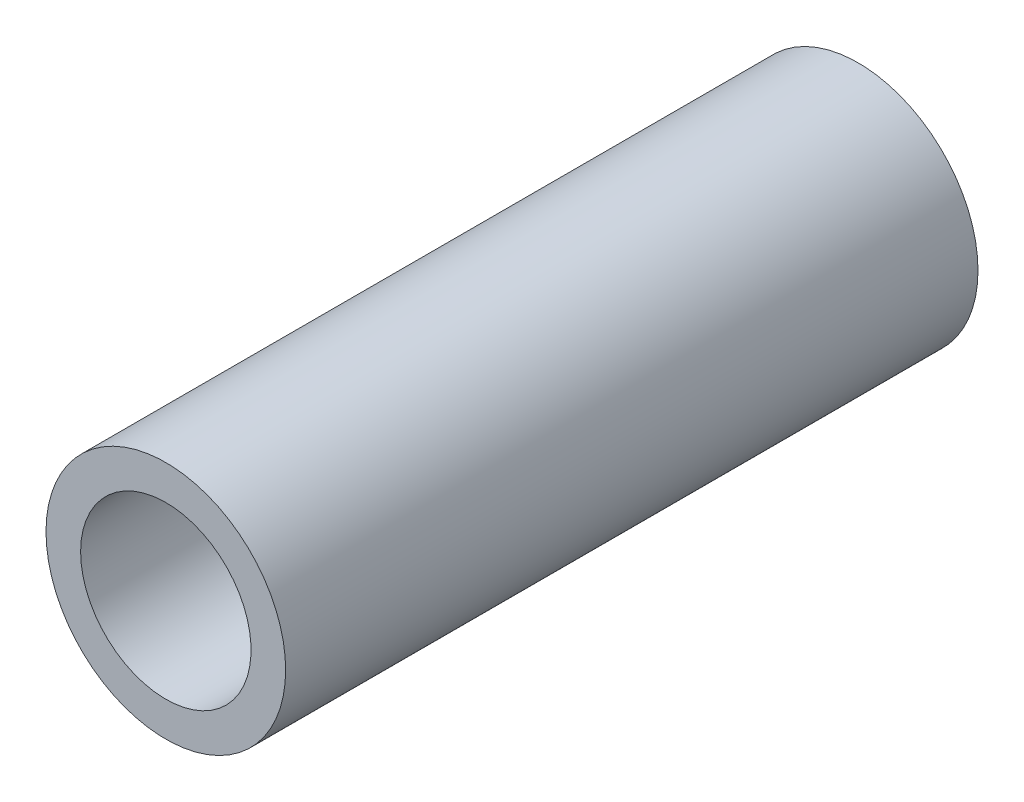
ISO-10303-21;
HEADER;
FILE_DESCRIPTION(('STEP AP214'),'2;1');
FILE_NAME('part.step','',(''),(''),'','','');
FILE_SCHEMA(('AUTOMOTIVE_DESIGN { 1 0 10303 214 1 1 1 1 }'));
ENDSEC;
DATA;
#1=APPLICATION_CONTEXT('core data for automotive mechanical design processes');
#2=APPLICATION_PROTOCOL_DEFINITION('international standard','automotive_design',2000,#1);
#3=PRODUCT_CONTEXT('',#1,'mechanical');
#4=PRODUCT('Part','Part','',(#3));
#5=PRODUCT_RELATED_PRODUCT_CATEGORY('part','',(#4));
#6=PRODUCT_DEFINITION_FORMATION('','',#4);
#7=PRODUCT_DEFINITION_CONTEXT('part definition',#1,'design');
#8=PRODUCT_DEFINITION('design','',#6,#7);
#9=PRODUCT_DEFINITION_SHAPE('','',#8);
#10=(LENGTH_UNIT() NAMED_UNIT(*) SI_UNIT(.MILLI.,.METRE.));
#11=(NAMED_UNIT(*) PLANE_ANGLE_UNIT() SI_UNIT($,.RADIAN.));
#12=(NAMED_UNIT(*) SI_UNIT($,.STERADIAN.) SOLID_ANGLE_UNIT());
#13=UNCERTAINTY_MEASURE_WITH_UNIT(LENGTH_MEASURE(1.E-05),#10,'distance_accuracy_value','');
#14=(GEOMETRIC_REPRESENTATION_CONTEXT(3) GLOBAL_UNCERTAINTY_ASSIGNED_CONTEXT((#13)) GLOBAL_UNIT_ASSIGNED_CONTEXT((#10,
#11,#12)) REPRESENTATION_CONTEXT('',''));
#15=CARTESIAN_POINT('',(0.,0.,0.));
#16=DIRECTION('',(0.,0.,1.));
#17=DIRECTION('',(1.,0.,0.));
#18=AXIS2_PLACEMENT_3D('',#15,#16,#17);
#19=CARTESIAN_POINT('',(0.,0.,6.5));
#20=DIRECTION('',(0.,0.,1.));
#21=DIRECTION('',(1.,0.,0.));
#22=AXIS2_PLACEMENT_3D('',#19,#20,#21);
#23=PLANE('',#22);
#24=CARTESIAN_POINT('',(0.,0.,6.5));
#25=DIRECTION('',(0.,0.,1.));
#26=DIRECTION('',(1.,0.,0.));
#27=AXIS2_PLACEMENT_3D('',#24,#25,#26);
#28=CIRCLE('',#27,2.25);
#29=CARTESIAN_POINT('',(-2.25,0.,6.5));
#30=VERTEX_POINT('',#29);
#31=EDGE_CURVE('E10',#30,#30,#28,.T.);
#32=ORIENTED_EDGE('',*,*,#31,.T.);
#33=EDGE_LOOP('',(#32));
#34=FACE_BOUND('',#33,.T.);
#35=CARTESIAN_POINT('',(0.,0.,6.5));
#36=DIRECTION('',(0.,0.,1.));
#37=DIRECTION('',(1.,0.,0.));
#38=AXIS2_PLACEMENT_3D('',#35,#36,#37);
#39=CIRCLE('',#38,1.6);
#40=CARTESIAN_POINT('',(-1.6,0.,6.5));
#41=VERTEX_POINT('',#40);
#42=EDGE_CURVE('E41',#41,#41,#39,.T.);
#43=ORIENTED_EDGE('',*,*,#42,.F.);
#44=EDGE_LOOP('',(#43));
#45=FACE_BOUND('',#44,.T.);
#46=ADVANCED_FACE('F30',(#34,#45),#23,.T.);
#47=CARTESIAN_POINT('',(0.,0.,-6.5));
#48=DIRECTION('',(0.,0.,1.));
#49=DIRECTION('',(1.,0.,0.));
#50=AXIS2_PLACEMENT_3D('',#47,#48,#49);
#51=PLANE('',#50);
#52=CARTESIAN_POINT('',(0.,0.,-6.5));
#53=DIRECTION('',(0.,0.,1.));
#54=DIRECTION('',(1.,0.,0.));
#55=AXIS2_PLACEMENT_3D('',#52,#53,#54);
#56=CIRCLE('',#55,2.25);
#57=CARTESIAN_POINT('',(-2.25,0.,-6.5));
#58=VERTEX_POINT('',#57);
#59=EDGE_CURVE('E34',#58,#58,#56,.T.);
#60=ORIENTED_EDGE('',*,*,#59,.F.);
#61=EDGE_LOOP('',(#60));
#62=FACE_BOUND('',#61,.T.);
#63=CARTESIAN_POINT('',(0.,0.,-6.5));
#64=DIRECTION('',(0.,0.,1.));
#65=DIRECTION('',(1.,0.,0.));
#66=AXIS2_PLACEMENT_3D('',#63,#64,#65);
#67=CIRCLE('',#66,1.6);
#68=CARTESIAN_POINT('',(-1.6,0.,-6.5));
#69=VERTEX_POINT('',#68);
#70=EDGE_CURVE('E43',#69,#69,#67,.T.);
#71=ORIENTED_EDGE('',*,*,#70,.T.);
#72=EDGE_LOOP('',(#71));
#73=FACE_BOUND('',#72,.T.);
#74=ADVANCED_FACE('F53',(#62,#73),#51,.F.);
#75=CARTESIAN_POINT('',(0.,0.,6.5));
#76=DIRECTION('',(0.,0.,-1.));
#77=DIRECTION('',(-1.,0.,0.));
#78=AXIS2_PLACEMENT_3D('',#75,#76,#77);
#79=CYLINDRICAL_SURFACE('',#78,2.25);
#80=CARTESIAN_POINT('',(-2.25,0.,6.5));
#81=CARTESIAN_POINT('',(-2.25,0.,6.36458333333333));
#82=CARTESIAN_POINT('',(-2.25,0.,6.22916666666667));
#83=CARTESIAN_POINT('',(-2.25,0.,5.95833333333333));
#84=CARTESIAN_POINT('',(-2.25,0.,5.82291666666667));
#85=CARTESIAN_POINT('',(-2.25,0.,5.55208333333333));
#86=CARTESIAN_POINT('',(-2.25,0.,5.41666666666667));
#87=CARTESIAN_POINT('',(-2.25,0.,5.14583333333333));
#88=CARTESIAN_POINT('',(-2.25,0.,5.01041666666667));
#89=CARTESIAN_POINT('',(-2.25,0.,4.73958333333333));
#90=CARTESIAN_POINT('',(-2.25,0.,4.60416666666667));
#91=CARTESIAN_POINT('',(-2.25,0.,4.33333333333333));
#92=CARTESIAN_POINT('',(-2.25,0.,4.19791666666667));
#93=CARTESIAN_POINT('',(-2.25,0.,3.92708333333333));
#94=CARTESIAN_POINT('',(-2.25,0.,3.79166666666667));
#95=CARTESIAN_POINT('',(-2.25,0.,3.52083333333333));
#96=CARTESIAN_POINT('',(-2.25,0.,3.38541666666667));
#97=CARTESIAN_POINT('',(-2.25,0.,3.11458333333333));
#98=CARTESIAN_POINT('',(-2.25,0.,2.97916666666667));
#99=CARTESIAN_POINT('',(-2.25,0.,2.70833333333333));
#100=CARTESIAN_POINT('',(-2.25,0.,2.57291666666667));
#101=CARTESIAN_POINT('',(-2.25,0.,2.30208333333333));
#102=CARTESIAN_POINT('',(-2.25,0.,2.16666666666667));
#103=CARTESIAN_POINT('',(-2.25,0.,1.89583333333333));
#104=CARTESIAN_POINT('',(-2.25,0.,1.76041666666667));
#105=CARTESIAN_POINT('',(-2.25,0.,1.48958333333333));
#106=CARTESIAN_POINT('',(-2.25,0.,1.35416666666667));
#107=CARTESIAN_POINT('',(-2.25,0.,1.08333333333333));
#108=CARTESIAN_POINT('',(-2.25,0.,0.947916666666666));
#109=CARTESIAN_POINT('',(-2.25,0.,0.677083333333332));
#110=CARTESIAN_POINT('',(-2.25,0.,0.541666666666666));
#111=CARTESIAN_POINT('',(-2.25,0.,0.270833333333333));
#112=CARTESIAN_POINT('',(-2.25,0.,0.135416666666666));
#113=CARTESIAN_POINT('',(-2.25,0.,-0.135416666666668));
#114=CARTESIAN_POINT('',(-2.25,0.,-0.270833333333334));
#115=CARTESIAN_POINT('',(-2.25,0.,-0.541666666666668));
#116=CARTESIAN_POINT('',(-2.25,0.,-0.677083333333334));
#117=CARTESIAN_POINT('',(-2.25,0.,-0.947916666666667));
#118=CARTESIAN_POINT('',(-2.25,0.,-1.08333333333333));
#119=CARTESIAN_POINT('',(-2.25,0.,-1.35416666666667));
#120=CARTESIAN_POINT('',(-2.25,0.,-1.48958333333333));
#121=CARTESIAN_POINT('',(-2.25,0.,-1.76041666666667));
#122=CARTESIAN_POINT('',(-2.25,0.,-1.89583333333333));
#123=CARTESIAN_POINT('',(-2.25,0.,-2.16666666666667));
#124=CARTESIAN_POINT('',(-2.25,0.,-2.30208333333333));
#125=CARTESIAN_POINT('',(-2.25,0.,-2.57291666666667));
#126=CARTESIAN_POINT('',(-2.25,0.,-2.70833333333333));
#127=CARTESIAN_POINT('',(-2.25,0.,-2.97916666666667));
#128=CARTESIAN_POINT('',(-2.25,0.,-3.11458333333333));
#129=CARTESIAN_POINT('',(-2.25,0.,-3.38541666666667));
#130=CARTESIAN_POINT('',(-2.25,0.,-3.52083333333333));
#131=CARTESIAN_POINT('',(-2.25,0.,-3.79166666666667));
#132=CARTESIAN_POINT('',(-2.25,0.,-3.92708333333333));
#133=CARTESIAN_POINT('',(-2.25,0.,-4.19791666666667));
#134=CARTESIAN_POINT('',(-2.25,0.,-4.33333333333333));
#135=CARTESIAN_POINT('',(-2.25,0.,-4.60416666666667));
#136=CARTESIAN_POINT('',(-2.25,0.,-4.73958333333333));
#137=CARTESIAN_POINT('',(-2.25,0.,-5.01041666666667));
#138=CARTESIAN_POINT('',(-2.25,0.,-5.14583333333333));
#139=CARTESIAN_POINT('',(-2.25,0.,-5.41666666666667));
#140=CARTESIAN_POINT('',(-2.25,0.,-5.55208333333333));
#141=CARTESIAN_POINT('',(-2.25,0.,-5.82291666666667));
#142=CARTESIAN_POINT('',(-2.25,0.,-5.95833333333333));
#143=CARTESIAN_POINT('',(-2.25,0.,-6.22916666666667));
#144=CARTESIAN_POINT('',(-2.25,0.,-6.36458333333333));
#145=CARTESIAN_POINT('',(-2.25,0.,-6.5));
#146=B_SPLINE_CURVE_WITH_KNOTS('',3,(#80,#81,#82,#83,#84,#85,#86,#87,#88,#89,#90,#91,#92,#93,
#94,#95,#96,#97,#98,#99,#100,#101,#102,#103,#104,#105,#106,#107,#108,#109,#110,#111,#112,#113,
#114,#115,#116,#117,#118,#119,#120,#121,#122,#123,#124,#125,#126,#127,#128,#129,#130,#131,#132,
#133,#134,#135,#136,#137,#138,#139,#140,#141,#142,#143,#144,#145),.UNSPECIFIED.,.F.,.F.,(4,2,2,
2,2,2,2,2,2,2,2,2,2,2,2,2,2,2,2,2,2,2,2,2,2,2,2,2,2,2,2,2,4),(0.,0.40625,0.8125,1.21875,1.625,
2.03125,2.4375,2.84375,3.25,3.65625,4.0625,4.46875,4.875,5.28125,5.6875,6.09375,6.5,6.90625,
7.3125,7.71875,8.125,8.53125,8.9375,9.34375,9.75,10.15625,10.5625,10.96875,11.375,11.78125,
12.1875,12.59375,13.),.UNSPECIFIED.);
#147=EDGE_CURVE('BSEAM32',#30,#58,#146,.T.);
#148=ORIENTED_EDGE('',*,*,#31,.F.);
#149=ORIENTED_EDGE('',*,*,#59,.T.);
#150=ORIENTED_EDGE('',*,*,#147,.T.);
#151=ORIENTED_EDGE('',*,*,#147,.F.);
#152=EDGE_LOOP('',(#148,#150,#149,#151));
#153=FACE_BOUND('',#152,.T.);
#154=ADVANCED_FACE('F32',(#153),#79,.T.);
#155=CARTESIAN_POINT('',(0.,0.,6.5));
#156=DIRECTION('',(0.,0.,-1.));
#157=DIRECTION('',(-1.,0.,0.));
#158=AXIS2_PLACEMENT_3D('',#155,#156,#157);
#159=CYLINDRICAL_SURFACE('',#158,1.6);
#160=CARTESIAN_POINT('',(-1.6,0.,6.5));
#161=CARTESIAN_POINT('',(-1.6,0.,6.36458333333333));
#162=CARTESIAN_POINT('',(-1.6,0.,6.22916666666667));
#163=CARTESIAN_POINT('',(-1.6,0.,5.95833333333333));
#164=CARTESIAN_POINT('',(-1.6,0.,5.82291666666667));
#165=CARTESIAN_POINT('',(-1.6,0.,5.55208333333333));
#166=CARTESIAN_POINT('',(-1.6,0.,5.41666666666667));
#167=CARTESIAN_POINT('',(-1.6,0.,5.14583333333333));
#168=CARTESIAN_POINT('',(-1.6,0.,5.01041666666667));
#169=CARTESIAN_POINT('',(-1.6,0.,4.73958333333333));
#170=CARTESIAN_POINT('',(-1.6,0.,4.60416666666667));
#171=CARTESIAN_POINT('',(-1.6,0.,4.33333333333333));
#172=CARTESIAN_POINT('',(-1.6,0.,4.19791666666667));
#173=CARTESIAN_POINT('',(-1.6,0.,3.92708333333333));
#174=CARTESIAN_POINT('',(-1.6,0.,3.79166666666667));
#175=CARTESIAN_POINT('',(-1.6,0.,3.52083333333333));
#176=CARTESIAN_POINT('',(-1.6,0.,3.38541666666667));
#177=CARTESIAN_POINT('',(-1.6,0.,3.11458333333333));
#178=CARTESIAN_POINT('',(-1.6,0.,2.97916666666667));
#179=CARTESIAN_POINT('',(-1.6,0.,2.70833333333333));
#180=CARTESIAN_POINT('',(-1.6,0.,2.57291666666667));
#181=CARTESIAN_POINT('',(-1.6,0.,2.30208333333333));
#182=CARTESIAN_POINT('',(-1.6,0.,2.16666666666667));
#183=CARTESIAN_POINT('',(-1.6,0.,1.89583333333333));
#184=CARTESIAN_POINT('',(-1.6,0.,1.76041666666667));
#185=CARTESIAN_POINT('',(-1.6,0.,1.48958333333333));
#186=CARTESIAN_POINT('',(-1.6,0.,1.35416666666667));
#187=CARTESIAN_POINT('',(-1.6,0.,1.08333333333333));
#188=CARTESIAN_POINT('',(-1.6,0.,0.947916666666667));
#189=CARTESIAN_POINT('',(-1.6,0.,0.677083333333333));
#190=CARTESIAN_POINT('',(-1.6,0.,0.541666666666667));
#191=CARTESIAN_POINT('',(-1.6,0.,0.270833333333334));
#192=CARTESIAN_POINT('',(-1.6,0.,0.135416666666667));
#193=CARTESIAN_POINT('',(-1.6,0.,-0.135416666666667));
#194=CARTESIAN_POINT('',(-1.6,0.,-0.270833333333334));
#195=CARTESIAN_POINT('',(-1.6,0.,-0.541666666666667));
#196=CARTESIAN_POINT('',(-1.6,0.,-0.677083333333333));
#197=CARTESIAN_POINT('',(-1.6,0.,-0.947916666666667));
#198=CARTESIAN_POINT('',(-1.6,0.,-1.08333333333333));
#199=CARTESIAN_POINT('',(-1.6,0.,-1.35416666666667));
#200=CARTESIAN_POINT('',(-1.6,0.,-1.48958333333333));
#201=CARTESIAN_POINT('',(-1.6,0.,-1.76041666666667));
#202=CARTESIAN_POINT('',(-1.6,0.,-1.89583333333333));
#203=CARTESIAN_POINT('',(-1.6,0.,-2.16666666666667));
#204=CARTESIAN_POINT('',(-1.6,0.,-2.30208333333333));
#205=CARTESIAN_POINT('',(-1.6,0.,-2.57291666666667));
#206=CARTESIAN_POINT('',(-1.6,0.,-2.70833333333333));
#207=CARTESIAN_POINT('',(-1.6,0.,-2.97916666666667));
#208=CARTESIAN_POINT('',(-1.6,0.,-3.11458333333333));
#209=CARTESIAN_POINT('',(-1.6,0.,-3.38541666666667));
#210=CARTESIAN_POINT('',(-1.6,0.,-3.52083333333333));
#211=CARTESIAN_POINT('',(-1.6,0.,-3.79166666666667));
#212=CARTESIAN_POINT('',(-1.6,0.,-3.92708333333333));
#213=CARTESIAN_POINT('',(-1.6,0.,-4.19791666666667));
#214=CARTESIAN_POINT('',(-1.6,0.,-4.33333333333333));
#215=CARTESIAN_POINT('',(-1.6,0.,-4.60416666666667));
#216=CARTESIAN_POINT('',(-1.6,0.,-4.73958333333333));
#217=CARTESIAN_POINT('',(-1.6,0.,-5.01041666666667));
#218=CARTESIAN_POINT('',(-1.6,0.,-5.14583333333333));
#219=CARTESIAN_POINT('',(-1.6,0.,-5.41666666666667));
#220=CARTESIAN_POINT('',(-1.6,0.,-5.55208333333333));
#221=CARTESIAN_POINT('',(-1.6,0.,-5.82291666666667));
#222=CARTESIAN_POINT('',(-1.6,0.,-5.95833333333333));
#223=CARTESIAN_POINT('',(-1.6,0.,-6.22916666666667));
#224=CARTESIAN_POINT('',(-1.6,0.,-6.36458333333333));
#225=CARTESIAN_POINT('',(-1.6,0.,-6.5));
#226=B_SPLINE_CURVE_WITH_KNOTS('',3,(#160,#161,#162,#163,#164,#165,#166,#167,#168,#169,#170,
#171,#172,#173,#174,#175,#176,#177,#178,#179,#180,#181,#182,#183,#184,#185,#186,#187,#188,#189,
#190,#191,#192,#193,#194,#195,#196,#197,#198,#199,#200,#201,#202,#203,#204,#205,#206,#207,#208,
#209,#210,#211,#212,#213,#214,#215,#216,#217,#218,#219,#220,#221,#222,#223,#224,#225),
.UNSPECIFIED.,.F.,.F.,(4,2,2,2,2,2,2,2,2,2,2,2,2,2,2,2,2,2,2,2,2,2,2,2,2,2,2,2,2,2,2,2,4),(0.,
0.40625,0.812500000000001,1.21875,1.625,2.03125,2.4375,2.84375,3.25,3.65625,4.0625,4.46875,
4.875,5.28125,5.6875,6.09375,6.5,6.90625,7.3125,7.71875,8.125,8.53125,8.9375,9.34375,9.75,
10.15625,10.5625,10.96875,11.375,11.78125,12.1875,12.59375,13.),.UNSPECIFIED.);
#227=EDGE_CURVE('BSEAM49',#41,#69,#226,.T.);
#228=ORIENTED_EDGE('',*,*,#42,.T.);
#229=ORIENTED_EDGE('',*,*,#70,.F.);
#230=ORIENTED_EDGE('',*,*,#227,.T.);
#231=ORIENTED_EDGE('',*,*,#227,.F.);
#232=EDGE_LOOP('',(#228,#230,#229,#231));
#233=FACE_BOUND('',#232,.T.);
#234=ADVANCED_FACE('F49',(#233),#159,.F.);
#235=CLOSED_SHELL('',(#46,#74,#154,#234));
#236=MANIFOLD_SOLID_BREP('B2',#235);
#237=ADVANCED_BREP_SHAPE_REPRESENTATION('',(#18,#236),#14);
#238=SHAPE_DEFINITION_REPRESENTATION(#9,#237);
ENDSEC;
END-ISO-10303-21;
